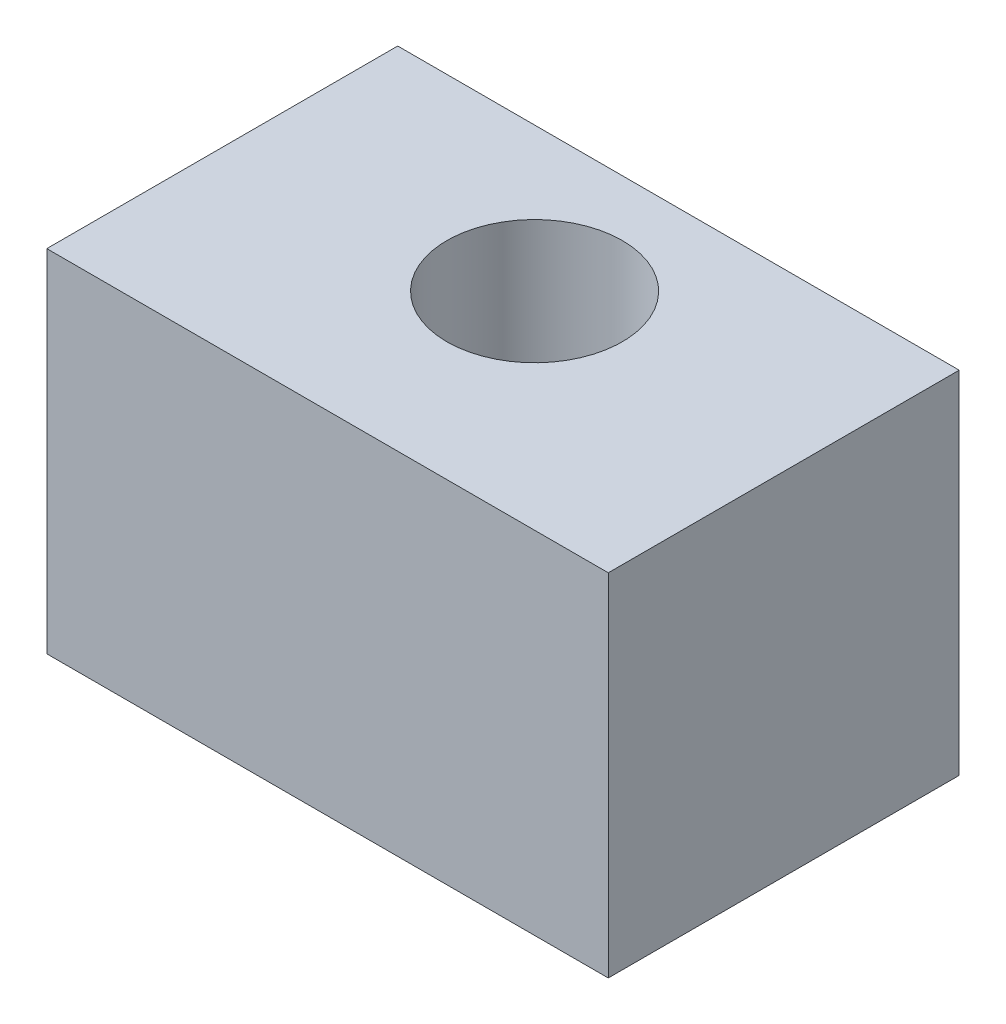
ISO-10303-21;
HEADER;
FILE_DESCRIPTION(('STEP AP214'),'2;1');
FILE_NAME('part.step','',(''),(''),'','','');
FILE_SCHEMA(('AUTOMOTIVE_DESIGN { 1 0 10303 214 1 1 1 1 }'));
ENDSEC;
DATA;
#1=APPLICATION_CONTEXT('core data for automotive mechanical design processes');
#2=APPLICATION_PROTOCOL_DEFINITION('international standard','automotive_design',2000,#1);
#3=PRODUCT_CONTEXT('',#1,'mechanical');
#4=PRODUCT('Part','Part','',(#3));
#5=PRODUCT_RELATED_PRODUCT_CATEGORY('part','',(#4));
#6=PRODUCT_DEFINITION_FORMATION('','',#4);
#7=PRODUCT_DEFINITION_CONTEXT('part definition',#1,'design');
#8=PRODUCT_DEFINITION('design','',#6,#7);
#9=PRODUCT_DEFINITION_SHAPE('','',#8);
#10=(LENGTH_UNIT() NAMED_UNIT(*) SI_UNIT(.MILLI.,.METRE.));
#11=(NAMED_UNIT(*) PLANE_ANGLE_UNIT() SI_UNIT($,.RADIAN.));
#12=(NAMED_UNIT(*) SI_UNIT($,.STERADIAN.) SOLID_ANGLE_UNIT());
#13=UNCERTAINTY_MEASURE_WITH_UNIT(LENGTH_MEASURE(1.E-05),#10,'distance_accuracy_value','');
#14=(GEOMETRIC_REPRESENTATION_CONTEXT(3) GLOBAL_UNCERTAINTY_ASSIGNED_CONTEXT((#13)) GLOBAL_UNIT_ASSIGNED_CONTEXT((#10,
#11,#12)) REPRESENTATION_CONTEXT('',''));
#15=CARTESIAN_POINT('',(0.,0.,0.));
#16=DIRECTION('',(0.,0.,1.));
#17=DIRECTION('',(1.,0.,0.));
#18=AXIS2_PLACEMENT_3D('',#15,#16,#17);
#19=CARTESIAN_POINT('',(0.,10.,0.));
#20=DIRECTION('',(0.,-1.,0.));
#21=DIRECTION('',(0.,0.,-1.));
#22=AXIS2_PLACEMENT_3D('',#19,#20,#21);
#23=PLANE('',#22);
#24=DIRECTION('',(0.,0.,1.));
#25=VECTOR('',#24,1.);
#26=CARTESIAN_POINT('',(0.,10.,0.));
#27=LINE('',#26,#25);
#28=CARTESIAN_POINT('',(0.,10.,-10.));
#29=VERTEX_POINT('',#28);
#30=CARTESIAN_POINT('',(0.,10.,0.));
#31=VERTEX_POINT('',#30);
#32=EDGE_CURVE('E92',#29,#31,#27,.T.);
#33=ORIENTED_EDGE('',*,*,#32,.T.);
#34=DIRECTION('',(1.,0.,0.));
#35=VECTOR('',#34,1.);
#36=CARTESIAN_POINT('',(0.,10.,0.));
#37=LINE('',#36,#35);
#38=CARTESIAN_POINT('',(16.,10.,0.));
#39=VERTEX_POINT('',#38);
#40=EDGE_CURVE('E87',#31,#39,#37,.T.);
#41=ORIENTED_EDGE('',*,*,#40,.T.);
#42=DIRECTION('',(0.,0.,-1.));
#43=VECTOR('',#42,1.);
#44=CARTESIAN_POINT('',(16.,10.,0.));
#45=LINE('',#44,#43);
#46=CARTESIAN_POINT('',(16.,10.,-10.));
#47=VERTEX_POINT('',#46);
#48=EDGE_CURVE('E90',#39,#47,#45,.T.);
#49=ORIENTED_EDGE('',*,*,#48,.T.);
#50=DIRECTION('',(-1.,0.,0.));
#51=VECTOR('',#50,1.);
#52=CARTESIAN_POINT('',(0.,10.,-10.));
#53=LINE('',#52,#51);
#54=EDGE_CURVE('E57',#47,#29,#53,.T.);
#55=ORIENTED_EDGE('',*,*,#54,.T.);
#56=EDGE_LOOP('',(#33,#41,#49,#55));
#57=FACE_BOUND('',#56,.T.);
#58=CARTESIAN_POINT('',(8.,10.,-5.9));
#59=DIRECTION('',(0.,1.,0.));
#60=DIRECTION('',(0.,0.,1.));
#61=AXIS2_PLACEMENT_3D('',#58,#59,#60);
#62=CIRCLE('',#61,2.5);
#63=CARTESIAN_POINT('',(8.,10.,-3.4));
#64=VERTEX_POINT('',#63);
#65=EDGE_CURVE('E112',#64,#64,#62,.T.);
#66=ORIENTED_EDGE('',*,*,#65,.F.);
#67=EDGE_LOOP('',(#66));
#68=FACE_BOUND('',#67,.T.);
#69=ADVANCED_FACE('F39',(#57,#68),#23,.F.);
#70=CARTESIAN_POINT('',(0.,0.,0.));
#71=DIRECTION('',(0.,-1.,0.));
#72=DIRECTION('',(0.,0.,-1.));
#73=AXIS2_PLACEMENT_3D('',#70,#71,#72);
#74=PLANE('',#73);
#75=DIRECTION('',(0.,0.,1.));
#76=VECTOR('',#75,1.);
#77=CARTESIAN_POINT('',(0.,0.,0.));
#78=LINE('',#77,#76);
#79=CARTESIAN_POINT('',(0.,0.,-10.));
#80=VERTEX_POINT('',#79);
#81=CARTESIAN_POINT('',(0.,0.,0.));
#82=VERTEX_POINT('',#81);
#83=EDGE_CURVE('E108',#80,#82,#78,.T.);
#84=ORIENTED_EDGE('',*,*,#83,.F.);
#85=DIRECTION('',(-1.,0.,0.));
#86=VECTOR('',#85,1.);
#87=CARTESIAN_POINT('',(0.,0.,-10.));
#88=LINE('',#87,#86);
#89=CARTESIAN_POINT('',(16.,0.,-10.));
#90=VERTEX_POINT('',#89);
#91=EDGE_CURVE('E80',#90,#80,#88,.T.);
#92=ORIENTED_EDGE('',*,*,#91,.F.);
#93=DIRECTION('',(0.,0.,-1.));
#94=VECTOR('',#93,1.);
#95=CARTESIAN_POINT('',(16.,0.,0.));
#96=LINE('',#95,#94);
#97=CARTESIAN_POINT('',(16.,0.,0.));
#98=VERTEX_POINT('',#97);
#99=EDGE_CURVE('E74',#98,#90,#96,.T.);
#100=ORIENTED_EDGE('',*,*,#99,.F.);
#101=DIRECTION('',(1.,0.,0.));
#102=VECTOR('',#101,1.);
#103=CARTESIAN_POINT('',(0.,0.,0.));
#104=LINE('',#103,#102);
#105=EDGE_CURVE('E97',#82,#98,#104,.T.);
#106=ORIENTED_EDGE('',*,*,#105,.F.);
#107=EDGE_LOOP('',(#84,#92,#100,#106));
#108=FACE_BOUND('',#107,.T.);
#109=CARTESIAN_POINT('',(8.,0.,-5.9));
#110=DIRECTION('',(0.,1.,0.));
#111=DIRECTION('',(0.,0.,1.));
#112=AXIS2_PLACEMENT_3D('',#109,#110,#111);
#113=CIRCLE('',#112,2.5);
#114=CARTESIAN_POINT('',(8.,0.,-3.4));
#115=VERTEX_POINT('',#114);
#116=EDGE_CURVE('E130',#115,#115,#113,.T.);
#117=ORIENTED_EDGE('',*,*,#116,.T.);
#118=EDGE_LOOP('',(#117));
#119=FACE_BOUND('',#118,.T.);
#120=ADVANCED_FACE('F125',(#108,#119),#74,.T.);
#121=CARTESIAN_POINT('',(0.,10.,0.));
#122=DIRECTION('',(1.,0.,0.));
#123=DIRECTION('',(0.,0.,-1.));
#124=AXIS2_PLACEMENT_3D('',#121,#122,#123);
#125=PLANE('',#124);
#126=ORIENTED_EDGE('',*,*,#83,.T.);
#127=DIRECTION('',(0.,-1.,0.));
#128=VECTOR('',#127,1.);
#129=CARTESIAN_POINT('',(0.,10.,0.));
#130=LINE('',#129,#128);
#131=EDGE_CURVE('E11',#31,#82,#130,.T.);
#132=ORIENTED_EDGE('',*,*,#131,.F.);
#133=ORIENTED_EDGE('',*,*,#32,.F.);
#134=DIRECTION('',(0.,-1.,0.));
#135=VECTOR('',#134,1.);
#136=CARTESIAN_POINT('',(0.,10.,-10.));
#137=LINE('',#136,#135);
#138=EDGE_CURVE('E104',#29,#80,#137,.T.);
#139=ORIENTED_EDGE('',*,*,#138,.T.);
#140=EDGE_LOOP('',(#126,#132,#133,#139));
#141=FACE_BOUND('',#140,.T.);
#142=ADVANCED_FACE('F41',(#141),#125,.F.);
#143=CARTESIAN_POINT('',(0.,10.,0.));
#144=DIRECTION('',(0.,0.,-1.));
#145=DIRECTION('',(-1.,0.,0.));
#146=AXIS2_PLACEMENT_3D('',#143,#144,#145);
#147=PLANE('',#146);
#148=ORIENTED_EDGE('',*,*,#105,.T.);
#149=DIRECTION('',(0.,-1.,0.));
#150=VECTOR('',#149,1.);
#151=CARTESIAN_POINT('',(16.,10.,0.));
#152=LINE('',#151,#150);
#153=EDGE_CURVE('E49',#39,#98,#152,.T.);
#154=ORIENTED_EDGE('',*,*,#153,.F.);
#155=ORIENTED_EDGE('',*,*,#40,.F.);
#156=ORIENTED_EDGE('',*,*,#131,.T.);
#157=EDGE_LOOP('',(#148,#154,#155,#156));
#158=FACE_BOUND('',#157,.T.);
#159=ADVANCED_FACE('F96',(#158),#147,.F.);
#160=CARTESIAN_POINT('',(16.,10.,0.));
#161=DIRECTION('',(-1.,0.,0.));
#162=DIRECTION('',(0.,0.,1.));
#163=AXIS2_PLACEMENT_3D('',#160,#161,#162);
#164=PLANE('',#163);
#165=ORIENTED_EDGE('',*,*,#99,.T.);
#166=DIRECTION('',(0.,-1.,0.));
#167=VECTOR('',#166,1.);
#168=CARTESIAN_POINT('',(16.,10.,-10.));
#169=LINE('',#168,#167);
#170=EDGE_CURVE('E99',#47,#90,#169,.T.);
#171=ORIENTED_EDGE('',*,*,#170,.F.);
#172=ORIENTED_EDGE('',*,*,#48,.F.);
#173=ORIENTED_EDGE('',*,*,#153,.T.);
#174=EDGE_LOOP('',(#165,#171,#172,#173));
#175=FACE_BOUND('',#174,.T.);
#176=ADVANCED_FACE('F100',(#175),#164,.F.);
#177=CARTESIAN_POINT('',(0.,10.,-10.));
#178=DIRECTION('',(0.,0.,1.));
#179=DIRECTION('',(1.,0.,0.));
#180=AXIS2_PLACEMENT_3D('',#177,#178,#179);
#181=PLANE('',#180);
#182=ORIENTED_EDGE('',*,*,#91,.T.);
#183=ORIENTED_EDGE('',*,*,#138,.F.);
#184=ORIENTED_EDGE('',*,*,#54,.F.);
#185=ORIENTED_EDGE('',*,*,#170,.T.);
#186=EDGE_LOOP('',(#182,#183,#184,#185));
#187=FACE_BOUND('',#186,.T.);
#188=ADVANCED_FACE('F122',(#187),#181,.F.);
#189=CARTESIAN_POINT('',(8.,10.,-5.9));
#190=DIRECTION('',(0.,-1.,0.));
#191=DIRECTION('',(0.,0.,-1.));
#192=AXIS2_PLACEMENT_3D('',#189,#190,#191);
#193=CYLINDRICAL_SURFACE('',#192,2.5);
#194=ORIENTED_EDGE('',*,*,#65,.T.);
#195=EDGE_LOOP('',(#194));
#196=FACE_BOUND('',#195,.T.);
#197=ORIENTED_EDGE('',*,*,#116,.F.);
#198=EDGE_LOOP('',(#197));
#199=FACE_BOUND('',#198,.T.);
#200=ADVANCED_FACE('F138',(#196,#199),#193,.F.);
#201=CLOSED_SHELL('',(#69,#120,#142,#159,#176,#188,#200));
#202=MANIFOLD_SOLID_BREP('B2',#201);
#203=ADVANCED_BREP_SHAPE_REPRESENTATION('',(#18,#202),#14);
#204=SHAPE_DEFINITION_REPRESENTATION(#9,#203);
ENDSEC;
END-ISO-10303-21;
